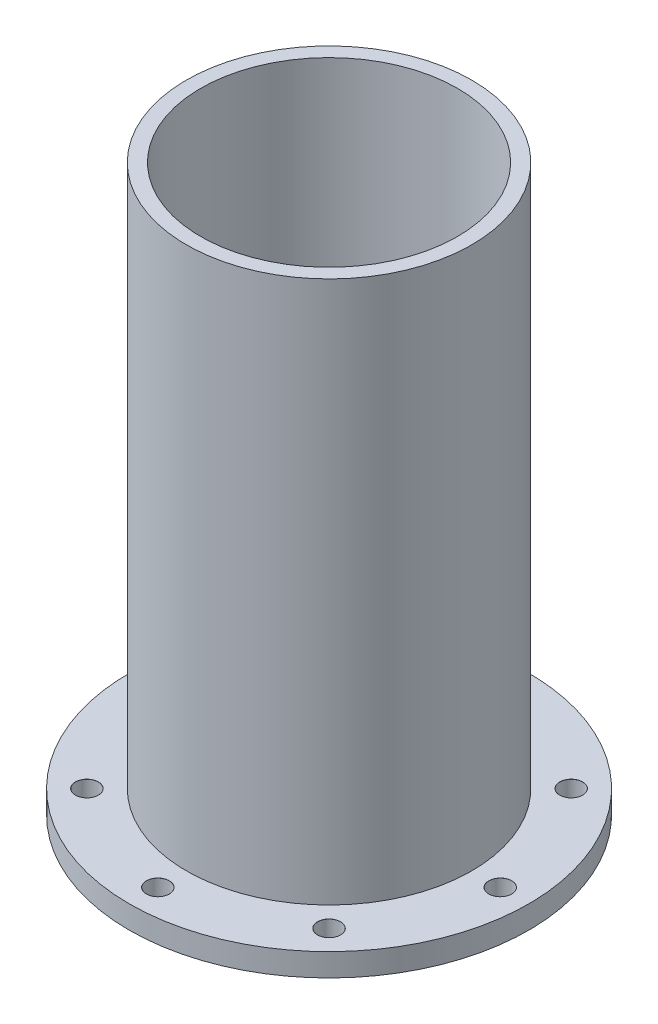
ISO-10303-21;
HEADER;
FILE_DESCRIPTION(('STEP AP214'),'2;1');
FILE_NAME('part.step','',(''),(''),'','','');
FILE_SCHEMA(('AUTOMOTIVE_DESIGN { 1 0 10303 214 1 1 1 1 }'));
ENDSEC;
DATA;
#1=APPLICATION_CONTEXT('core data for automotive mechanical design processes');
#2=APPLICATION_PROTOCOL_DEFINITION('international standard','automotive_design',2000,#1);
#3=PRODUCT_CONTEXT('',#1,'mechanical');
#4=PRODUCT('Part','Part','',(#3));
#5=PRODUCT_RELATED_PRODUCT_CATEGORY('part','',(#4));
#6=PRODUCT_DEFINITION_FORMATION('','',#4);
#7=PRODUCT_DEFINITION_CONTEXT('part definition',#1,'design');
#8=PRODUCT_DEFINITION('design','',#6,#7);
#9=PRODUCT_DEFINITION_SHAPE('','',#8);
#10=(LENGTH_UNIT() NAMED_UNIT(*) SI_UNIT(.MILLI.,.METRE.));
#11=(NAMED_UNIT(*) PLANE_ANGLE_UNIT() SI_UNIT($,.RADIAN.));
#12=(NAMED_UNIT(*) SI_UNIT($,.STERADIAN.) SOLID_ANGLE_UNIT());
#13=UNCERTAINTY_MEASURE_WITH_UNIT(LENGTH_MEASURE(1.E-05),#10,'distance_accuracy_value','');
#14=(GEOMETRIC_REPRESENTATION_CONTEXT(3) GLOBAL_UNCERTAINTY_ASSIGNED_CONTEXT((#13)) GLOBAL_UNIT_ASSIGNED_CONTEXT((#10,
#11,#12)) REPRESENTATION_CONTEXT('',''));
#15=CARTESIAN_POINT('',(0.,0.,0.));
#16=DIRECTION('',(0.,0.,1.));
#17=DIRECTION('',(1.,0.,0.));
#18=AXIS2_PLACEMENT_3D('',#15,#16,#17);
#19=CARTESIAN_POINT('',(0.,0.,0.));
#20=DIRECTION('',(0.,-1.,0.));
#21=DIRECTION('',(0.,0.,-1.));
#22=AXIS2_PLACEMENT_3D('',#19,#20,#21);
#23=PLANE('',#22);
#24=CARTESIAN_POINT('',(0.,0.,0.));
#25=DIRECTION('',(0.,-1.,0.));
#26=DIRECTION('',(0.,0.,-1.));
#27=AXIS2_PLACEMENT_3D('',#24,#25,#26);
#28=CIRCLE('',#27,45.);
#29=CARTESIAN_POINT('',(0.,0.,-45.));
#30=VERTEX_POINT('',#29);
#31=EDGE_CURVE('E132',#30,#30,#28,.T.);
#32=ORIENTED_EDGE('',*,*,#31,.F.);
#33=EDGE_LOOP('',(#32));
#34=FACE_BOUND('',#33,.T.);
#35=CARTESIAN_POINT('',(-42.4264068711934,0.,42.4264068711923));
#36=DIRECTION('',(0.,1.,0.));
#37=DIRECTION('',(0.,0.,1.));
#38=AXIS2_PLACEMENT_3D('',#35,#36,#37);
#39=CIRCLE('',#38,4.);
#40=CARTESIAN_POINT('',(-42.4264068711934,0.,46.4264068711923));
#41=VERTEX_POINT('',#40);
#42=EDGE_CURVE('E116',#41,#41,#39,.T.);
#43=ORIENTED_EDGE('',*,*,#42,.T.);
#44=EDGE_LOOP('',(#43));
#45=FACE_BOUND('',#44,.T.);
#46=CARTESIAN_POINT('',(-6.28466640991764E-13,0.,60.));
#47=DIRECTION('',(0.,1.,0.));
#48=DIRECTION('',(0.,0.,1.));
#49=AXIS2_PLACEMENT_3D('',#46,#47,#48);
#50=CIRCLE('',#49,4.);
#51=CARTESIAN_POINT('',(-6.28466640991764E-13,0.,64.));
#52=VERTEX_POINT('',#51);
#53=EDGE_CURVE('E107',#52,#52,#50,.T.);
#54=ORIENTED_EDGE('',*,*,#53,.T.);
#55=EDGE_LOOP('',(#54));
#56=FACE_BOUND('',#55,.T.);
#57=CARTESIAN_POINT('',(42.4264068711925,0.,42.4264068711932));
#58=DIRECTION('',(0.,1.,0.));
#59=DIRECTION('',(0.,0.,1.));
#60=AXIS2_PLACEMENT_3D('',#57,#58,#59);
#61=CIRCLE('',#60,4.);
#62=CARTESIAN_POINT('',(42.4264068711925,0.,46.4264068711932));
#63=VERTEX_POINT('',#62);
#64=EDGE_CURVE('E98',#63,#63,#61,.T.);
#65=ORIENTED_EDGE('',*,*,#64,.T.);
#66=EDGE_LOOP('',(#65));
#67=FACE_BOUND('',#66,.T.);
#68=CARTESIAN_POINT('',(60.,0.,0.));
#69=DIRECTION('',(0.,1.,0.));
#70=DIRECTION('',(0.,0.,1.));
#71=AXIS2_PLACEMENT_3D('',#68,#69,#70);
#72=CIRCLE('',#71,4.);
#73=CARTESIAN_POINT('',(60.,0.,4.));
#74=VERTEX_POINT('',#73);
#75=EDGE_CURVE('E89',#74,#74,#72,.T.);
#76=ORIENTED_EDGE('',*,*,#75,.T.);
#77=EDGE_LOOP('',(#76));
#78=FACE_BOUND('',#77,.T.);
#79=CARTESIAN_POINT('',(0.,0.,0.));
#80=DIRECTION('',(0.,1.,0.));
#81=DIRECTION('',(0.,0.,1.));
#82=AXIS2_PLACEMENT_3D('',#79,#80,#81);
#83=CIRCLE('',#82,70.);
#84=CARTESIAN_POINT('',(0.,0.,70.));
#85=VERTEX_POINT('',#84);
#86=EDGE_CURVE('E46',#85,#85,#83,.T.);
#87=ORIENTED_EDGE('',*,*,#86,.F.);
#88=EDGE_LOOP('',(#87));
#89=FACE_BOUND('',#88,.T.);
#90=CARTESIAN_POINT('',(-60.,0.,0.));
#91=DIRECTION('',(0.,1.,0.));
#92=DIRECTION('',(0.,0.,1.));
#93=AXIS2_PLACEMENT_3D('',#90,#91,#92);
#94=CIRCLE('',#93,4.);
#95=CARTESIAN_POINT('',(-60.,0.,4.));
#96=VERTEX_POINT('',#95);
#97=EDGE_CURVE('E50',#96,#96,#94,.T.);
#98=ORIENTED_EDGE('',*,*,#97,.T.);
#99=EDGE_LOOP('',(#98));
#100=FACE_BOUND('',#99,.T.);
#101=CARTESIAN_POINT('',(-42.4264068711928,0.,-42.4264068711929));
#102=DIRECTION('',(0.,1.,0.));
#103=DIRECTION('',(0.,0.,1.));
#104=AXIS2_PLACEMENT_3D('',#101,#102,#103);
#105=CIRCLE('',#104,4.);
#106=CARTESIAN_POINT('',(-42.4264068711928,0.,-38.4264068711929));
#107=VERTEX_POINT('',#106);
#108=EDGE_CURVE('E62',#107,#107,#105,.T.);
#109=ORIENTED_EDGE('',*,*,#108,.T.);
#110=EDGE_LOOP('',(#109));
#111=FACE_BOUND('',#110,.T.);
#112=CARTESIAN_POINT('',(2.09488880330588E-13,0.,-60.));
#113=DIRECTION('',(0.,1.,0.));
#114=DIRECTION('',(0.,0.,1.));
#115=AXIS2_PLACEMENT_3D('',#112,#113,#114);
#116=CIRCLE('',#115,4.);
#117=CARTESIAN_POINT('',(2.09488880330588E-13,0.,-56.));
#118=VERTEX_POINT('',#117);
#119=EDGE_CURVE('E71',#118,#118,#116,.T.);
#120=ORIENTED_EDGE('',*,*,#119,.T.);
#121=EDGE_LOOP('',(#120));
#122=FACE_BOUND('',#121,.T.);
#123=CARTESIAN_POINT('',(42.4264068711931,0.,-42.4264068711926));
#124=DIRECTION('',(0.,1.,0.));
#125=DIRECTION('',(0.,0.,1.));
#126=AXIS2_PLACEMENT_3D('',#123,#124,#125);
#127=CIRCLE('',#126,4.);
#128=CARTESIAN_POINT('',(42.4264068711931,0.,-38.4264068711926));
#129=VERTEX_POINT('',#128);
#130=EDGE_CURVE('E80',#129,#129,#127,.T.);
#131=ORIENTED_EDGE('',*,*,#130,.T.);
#132=EDGE_LOOP('',(#131));
#133=FACE_BOUND('',#132,.T.);
#134=ADVANCED_FACE('F39',(#34,#45,#56,#67,#78,#89,#100,#111,#122,#133),#23,.T.);
#135=CARTESIAN_POINT('',(0.,8.,0.));
#136=DIRECTION('',(0.,1.,0.));
#137=DIRECTION('',(0.,0.,1.));
#138=AXIS2_PLACEMENT_3D('',#135,#136,#137);
#139=PLANE('',#138);
#140=CARTESIAN_POINT('',(0.,7.99999999999999,0.));
#141=DIRECTION('',(0.,-1.,0.));
#142=DIRECTION('',(0.,0.,-1.));
#143=AXIS2_PLACEMENT_3D('',#140,#141,#142);
#144=CIRCLE('',#143,50.);
#145=CARTESIAN_POINT('',(0.,7.99999999999999,-50.));
#146=VERTEX_POINT('',#145);
#147=EDGE_CURVE('E128',#146,#146,#144,.T.);
#148=ORIENTED_EDGE('',*,*,#147,.T.);
#149=EDGE_LOOP('',(#148));
#150=FACE_BOUND('',#149,.T.);
#151=CARTESIAN_POINT('',(-42.4264068711934,8.,42.4264068711923));
#152=DIRECTION('',(0.,1.,0.));
#153=DIRECTION('',(0.,0.,1.));
#154=AXIS2_PLACEMENT_3D('',#151,#152,#153);
#155=CIRCLE('',#154,4.025);
#156=CARTESIAN_POINT('',(-42.4264068711934,8.,46.4514068711923));
#157=VERTEX_POINT('',#156);
#158=EDGE_CURVE('E122',#157,#157,#155,.T.);
#159=ORIENTED_EDGE('',*,*,#158,.F.);
#160=EDGE_LOOP('',(#159));
#161=FACE_BOUND('',#160,.T.);
#162=CARTESIAN_POINT('',(-6.28466640991764E-13,8.,60.));
#163=DIRECTION('',(0.,1.,0.));
#164=DIRECTION('',(0.,0.,1.));
#165=AXIS2_PLACEMENT_3D('',#162,#163,#164);
#166=CIRCLE('',#165,4.025);
#167=CARTESIAN_POINT('',(-6.28466640991764E-13,8.,64.025));
#168=VERTEX_POINT('',#167);
#169=EDGE_CURVE('E113',#168,#168,#166,.T.);
#170=ORIENTED_EDGE('',*,*,#169,.F.);
#171=EDGE_LOOP('',(#170));
#172=FACE_BOUND('',#171,.T.);
#173=CARTESIAN_POINT('',(42.4264068711925,8.,42.4264068711932));
#174=DIRECTION('',(0.,1.,0.));
#175=DIRECTION('',(0.,0.,1.));
#176=AXIS2_PLACEMENT_3D('',#173,#174,#175);
#177=CIRCLE('',#176,4.025);
#178=CARTESIAN_POINT('',(42.4264068711925,8.,46.4514068711932));
#179=VERTEX_POINT('',#178);
#180=EDGE_CURVE('E104',#179,#179,#177,.T.);
#181=ORIENTED_EDGE('',*,*,#180,.F.);
#182=EDGE_LOOP('',(#181));
#183=FACE_BOUND('',#182,.T.);
#184=CARTESIAN_POINT('',(60.,8.,0.));
#185=DIRECTION('',(0.,1.,0.));
#186=DIRECTION('',(0.,0.,1.));
#187=AXIS2_PLACEMENT_3D('',#184,#185,#186);
#188=CIRCLE('',#187,4.025);
#189=CARTESIAN_POINT('',(60.,8.,4.025));
#190=VERTEX_POINT('',#189);
#191=EDGE_CURVE('E95',#190,#190,#188,.T.);
#192=ORIENTED_EDGE('',*,*,#191,.F.);
#193=EDGE_LOOP('',(#192));
#194=FACE_BOUND('',#193,.T.);
#195=CARTESIAN_POINT('',(42.4264068711931,8.,-42.4264068711926));
#196=DIRECTION('',(0.,1.,0.));
#197=DIRECTION('',(0.,0.,1.));
#198=AXIS2_PLACEMENT_3D('',#195,#196,#197);
#199=CIRCLE('',#198,4.025);
#200=CARTESIAN_POINT('',(42.4264068711931,8.,-38.4014068711926));
#201=VERTEX_POINT('',#200);
#202=EDGE_CURVE('E86',#201,#201,#199,.T.);
#203=ORIENTED_EDGE('',*,*,#202,.F.);
#204=EDGE_LOOP('',(#203));
#205=FACE_BOUND('',#204,.T.);
#206=CARTESIAN_POINT('',(2.09488880330588E-13,8.,-60.));
#207=DIRECTION('',(0.,1.,0.));
#208=DIRECTION('',(0.,0.,1.));
#209=AXIS2_PLACEMENT_3D('',#206,#207,#208);
#210=CIRCLE('',#209,4.025);
#211=CARTESIAN_POINT('',(2.09488880330588E-13,8.,-55.975));
#212=VERTEX_POINT('',#211);
#213=EDGE_CURVE('E77',#212,#212,#210,.T.);
#214=ORIENTED_EDGE('',*,*,#213,.F.);
#215=EDGE_LOOP('',(#214));
#216=FACE_BOUND('',#215,.T.);
#217=CARTESIAN_POINT('',(-42.4264068711928,8.,-42.4264068711929));
#218=DIRECTION('',(0.,1.,0.));
#219=DIRECTION('',(0.,0.,1.));
#220=AXIS2_PLACEMENT_3D('',#217,#218,#219);
#221=CIRCLE('',#220,4.025);
#222=CARTESIAN_POINT('',(-42.4264068711928,8.,-38.4014068711929));
#223=VERTEX_POINT('',#222);
#224=EDGE_CURVE('E68',#223,#223,#221,.T.);
#225=ORIENTED_EDGE('',*,*,#224,.F.);
#226=EDGE_LOOP('',(#225));
#227=FACE_BOUND('',#226,.T.);
#228=CARTESIAN_POINT('',(-60.,8.,0.));
#229=DIRECTION('',(0.,1.,0.));
#230=DIRECTION('',(0.,0.,1.));
#231=AXIS2_PLACEMENT_3D('',#228,#229,#230);
#232=CIRCLE('',#231,4.025);
#233=CARTESIAN_POINT('',(-60.,8.,4.025));
#234=VERTEX_POINT('',#233);
#235=EDGE_CURVE('E59',#234,#234,#232,.T.);
#236=ORIENTED_EDGE('',*,*,#235,.F.);
#237=EDGE_LOOP('',(#236));
#238=FACE_BOUND('',#237,.T.);
#239=CARTESIAN_POINT('',(0.,7.99999999999999,0.));
#240=DIRECTION('',(0.,1.,0.));
#241=DIRECTION('',(0.,0.,1.));
#242=AXIS2_PLACEMENT_3D('',#239,#240,#241);
#243=CIRCLE('',#242,70.);
#244=CARTESIAN_POINT('',(0.,7.99999999999999,70.));
#245=VERTEX_POINT('',#244);
#246=EDGE_CURVE('E10',#245,#245,#243,.T.);
#247=ORIENTED_EDGE('',*,*,#246,.T.);
#248=EDGE_LOOP('',(#247));
#249=FACE_BOUND('',#248,.T.);
#250=ADVANCED_FACE('F41',(#150,#161,#172,#183,#194,#205,#216,#227,#238,#249),#139,.T.);
#251=CARTESIAN_POINT('',(0.,76.6194972326676,0.));
#252=DIRECTION('',(0.,1.,0.));
#253=DIRECTION('',(0.,0.,1.));
#254=AXIS2_PLACEMENT_3D('',#251,#252,#253);
#255=CYLINDRICAL_SURFACE('',#254,70.);
#256=ORIENTED_EDGE('',*,*,#86,.T.);
#257=EDGE_LOOP('',(#256));
#258=FACE_BOUND('',#257,.T.);
#259=ORIENTED_EDGE('',*,*,#246,.F.);
#260=EDGE_LOOP('',(#259));
#261=FACE_BOUND('',#260,.T.);
#262=ADVANCED_FACE('F184',(#258,#261),#255,.T.);
#263=CARTESIAN_POINT('',(-60.,8.,0.));
#264=DIRECTION('',(0.,1.,0.));
#265=DIRECTION('',(0.,0.,1.));
#266=AXIS2_PLACEMENT_3D('',#263,#264,#265);
#267=CYLINDRICAL_SURFACE('',#266,4.);
#268=ORIENTED_EDGE('',*,*,#97,.F.);
#269=EDGE_LOOP('',(#268));
#270=FACE_BOUND('',#269,.T.);
#271=CARTESIAN_POINT('',(-60.,7.97902250922056,0.));
#272=DIRECTION('',(0.,1.,0.));
#273=DIRECTION('',(0.,0.,1.));
#274=AXIS2_PLACEMENT_3D('',#271,#272,#273);
#275=CIRCLE('',#274,4.);
#276=CARTESIAN_POINT('',(-60.,7.97902250922056,4.));
#277=VERTEX_POINT('',#276);
#278=EDGE_CURVE('E54',#277,#277,#275,.T.);
#279=ORIENTED_EDGE('',*,*,#278,.T.);
#280=EDGE_LOOP('',(#279));
#281=FACE_BOUND('',#280,.T.);
#282=ADVANCED_FACE('F195',(#270,#281),#267,.F.);
#283=CARTESIAN_POINT('',(-60.,8.,0.));
#284=DIRECTION('',(0.,1.,0.));
#285=DIRECTION('',(0.,0.,1.));
#286=AXIS2_PLACEMENT_3D('',#283,#284,#285);
#287=CONICAL_SURFACE('',#286,4.025,0.87266462599705);
#288=ORIENTED_EDGE('',*,*,#278,.F.);
#289=EDGE_LOOP('',(#288));
#290=FACE_BOUND('',#289,.T.);
#291=ORIENTED_EDGE('',*,*,#235,.T.);
#292=EDGE_LOOP('',(#291));
#293=FACE_BOUND('',#292,.T.);
#294=ADVANCED_FACE('F192',(#290,#293),#287,.F.);
#295=CARTESIAN_POINT('',(-42.4264068711928,8.,-42.4264068711929));
#296=DIRECTION('',(0.,1.,0.));
#297=DIRECTION('',(0.,0.,1.));
#298=AXIS2_PLACEMENT_3D('',#295,#296,#297);
#299=CYLINDRICAL_SURFACE('',#298,4.);
#300=ORIENTED_EDGE('',*,*,#108,.F.);
#301=EDGE_LOOP('',(#300));
#302=FACE_BOUND('',#301,.T.);
#303=CARTESIAN_POINT('',(-42.4264068711928,7.97902250922056,-42.4264068711929));
#304=DIRECTION('',(0.,1.,0.));
#305=DIRECTION('',(0.,0.,1.));
#306=AXIS2_PLACEMENT_3D('',#303,#304,#305);
#307=CIRCLE('',#306,4.);
#308=CARTESIAN_POINT('',(-42.4264068711928,7.97902250922056,-38.4264068711929));
#309=VERTEX_POINT('',#308);
#310=EDGE_CURVE('E65',#309,#309,#307,.T.);
#311=ORIENTED_EDGE('',*,*,#310,.T.);
#312=EDGE_LOOP('',(#311));
#313=FACE_BOUND('',#312,.T.);
#314=ADVANCED_FACE('F194',(#302,#313),#299,.F.);
#315=CARTESIAN_POINT('',(-42.4264068711928,8.,-42.4264068711929));
#316=DIRECTION('',(0.,1.,0.));
#317=DIRECTION('',(0.,0.,1.));
#318=AXIS2_PLACEMENT_3D('',#315,#316,#317);
#319=CONICAL_SURFACE('',#318,4.025,0.872664625997186);
#320=ORIENTED_EDGE('',*,*,#310,.F.);
#321=EDGE_LOOP('',(#320));
#322=FACE_BOUND('',#321,.T.);
#323=ORIENTED_EDGE('',*,*,#224,.T.);
#324=EDGE_LOOP('',(#323));
#325=FACE_BOUND('',#324,.T.);
#326=ADVANCED_FACE('F202',(#322,#325),#319,.F.);
#327=CARTESIAN_POINT('',(2.09488880330588E-13,8.,-60.));
#328=DIRECTION('',(0.,1.,0.));
#329=DIRECTION('',(0.,0.,1.));
#330=AXIS2_PLACEMENT_3D('',#327,#328,#329);
#331=CYLINDRICAL_SURFACE('',#330,4.);
#332=ORIENTED_EDGE('',*,*,#119,.F.);
#333=EDGE_LOOP('',(#332));
#334=FACE_BOUND('',#333,.T.);
#335=CARTESIAN_POINT('',(2.09488880330588E-13,7.97902250922056,-60.));
#336=DIRECTION('',(0.,1.,0.));
#337=DIRECTION('',(0.,0.,1.));
#338=AXIS2_PLACEMENT_3D('',#335,#336,#337);
#339=CIRCLE('',#338,4.);
#340=CARTESIAN_POINT('',(2.09488880330588E-13,7.97902250922056,-56.));
#341=VERTEX_POINT('',#340);
#342=EDGE_CURVE('E74',#341,#341,#339,.T.);
#343=ORIENTED_EDGE('',*,*,#342,.T.);
#344=EDGE_LOOP('',(#343));
#345=FACE_BOUND('',#344,.T.);
#346=ADVANCED_FACE('F231',(#334,#345),#331,.F.);
#347=CARTESIAN_POINT('',(2.09488880330588E-13,8.,-60.));
#348=DIRECTION('',(0.,1.,0.));
#349=DIRECTION('',(0.,0.,1.));
#350=AXIS2_PLACEMENT_3D('',#347,#348,#349);
#351=CONICAL_SURFACE('',#350,4.025,0.872664625997118);
#352=ORIENTED_EDGE('',*,*,#342,.F.);
#353=EDGE_LOOP('',(#352));
#354=FACE_BOUND('',#353,.T.);
#355=ORIENTED_EDGE('',*,*,#213,.T.);
#356=EDGE_LOOP('',(#355));
#357=FACE_BOUND('',#356,.T.);
#358=ADVANCED_FACE('F172',(#354,#357),#351,.F.);
#359=CARTESIAN_POINT('',(42.4264068711931,8.,-42.4264068711926));
#360=DIRECTION('',(0.,1.,0.));
#361=DIRECTION('',(0.,0.,1.));
#362=AXIS2_PLACEMENT_3D('',#359,#360,#361);
#363=CYLINDRICAL_SURFACE('',#362,4.);
#364=ORIENTED_EDGE('',*,*,#130,.F.);
#365=EDGE_LOOP('',(#364));
#366=FACE_BOUND('',#365,.T.);
#367=CARTESIAN_POINT('',(42.4264068711931,7.97902250922056,-42.4264068711926));
#368=DIRECTION('',(0.,1.,0.));
#369=DIRECTION('',(0.,0.,1.));
#370=AXIS2_PLACEMENT_3D('',#367,#368,#369);
#371=CIRCLE('',#370,4.);
#372=CARTESIAN_POINT('',(42.4264068711931,7.97902250922056,-38.4264068711926));
#373=VERTEX_POINT('',#372);
#374=EDGE_CURVE('E83',#373,#373,#371,.T.);
#375=ORIENTED_EDGE('',*,*,#374,.T.);
#376=EDGE_LOOP('',(#375));
#377=FACE_BOUND('',#376,.T.);
#378=ADVANCED_FACE('F168',(#366,#377),#363,.F.);
#379=CARTESIAN_POINT('',(42.4264068711931,8.,-42.4264068711926));
#380=DIRECTION('',(0.,1.,0.));
#381=DIRECTION('',(0.,0.,1.));
#382=AXIS2_PLACEMENT_3D('',#379,#380,#381);
#383=CONICAL_SURFACE('',#382,4.025,0.87266462599705);
#384=ORIENTED_EDGE('',*,*,#374,.F.);
#385=EDGE_LOOP('',(#384));
#386=FACE_BOUND('',#385,.T.);
#387=ORIENTED_EDGE('',*,*,#202,.T.);
#388=EDGE_LOOP('',(#387));
#389=FACE_BOUND('',#388,.T.);
#390=ADVANCED_FACE('F171',(#386,#389),#383,.F.);
#391=CARTESIAN_POINT('',(60.,8.,0.));
#392=DIRECTION('',(0.,1.,0.));
#393=DIRECTION('',(0.,0.,1.));
#394=AXIS2_PLACEMENT_3D('',#391,#392,#393);
#395=CYLINDRICAL_SURFACE('',#394,4.);
#396=ORIENTED_EDGE('',*,*,#75,.F.);
#397=EDGE_LOOP('',(#396));
#398=FACE_BOUND('',#397,.T.);
#399=CARTESIAN_POINT('',(60.,7.97902250922056,0.));
#400=DIRECTION('',(0.,1.,0.));
#401=DIRECTION('',(0.,0.,1.));
#402=AXIS2_PLACEMENT_3D('',#399,#400,#401);
#403=CIRCLE('',#402,4.);
#404=CARTESIAN_POINT('',(60.,7.97902250922056,4.));
#405=VERTEX_POINT('',#404);
#406=EDGE_CURVE('E92',#405,#405,#403,.T.);
#407=ORIENTED_EDGE('',*,*,#406,.T.);
#408=EDGE_LOOP('',(#407));
#409=FACE_BOUND('',#408,.T.);
#410=ADVANCED_FACE('F178',(#398,#409),#395,.F.);
#411=CARTESIAN_POINT('',(60.,8.,0.));
#412=DIRECTION('',(0.,1.,0.));
#413=DIRECTION('',(0.,0.,1.));
#414=AXIS2_PLACEMENT_3D('',#411,#412,#413);
#415=CONICAL_SURFACE('',#414,4.025,0.87266462599705);
#416=ORIENTED_EDGE('',*,*,#406,.F.);
#417=EDGE_LOOP('',(#416));
#418=FACE_BOUND('',#417,.T.);
#419=ORIENTED_EDGE('',*,*,#191,.T.);
#420=EDGE_LOOP('',(#419));
#421=FACE_BOUND('',#420,.T.);
#422=ADVANCED_FACE('F257',(#418,#421),#415,.F.);
#423=CARTESIAN_POINT('',(42.4264068711925,8.,42.4264068711932));
#424=DIRECTION('',(0.,1.,0.));
#425=DIRECTION('',(0.,0.,1.));
#426=AXIS2_PLACEMENT_3D('',#423,#424,#425);
#427=CYLINDRICAL_SURFACE('',#426,4.);
#428=ORIENTED_EDGE('',*,*,#64,.F.);
#429=EDGE_LOOP('',(#428));
#430=FACE_BOUND('',#429,.T.);
#431=CARTESIAN_POINT('',(42.4264068711925,7.97902250922056,42.4264068711932));
#432=DIRECTION('',(0.,1.,0.));
#433=DIRECTION('',(0.,0.,1.));
#434=AXIS2_PLACEMENT_3D('',#431,#432,#433);
#435=CIRCLE('',#434,4.);
#436=CARTESIAN_POINT('',(42.4264068711925,7.97902250922056,46.4264068711932));
#437=VERTEX_POINT('',#436);
#438=EDGE_CURVE('E101',#437,#437,#435,.T.);
#439=ORIENTED_EDGE('',*,*,#438,.T.);
#440=EDGE_LOOP('',(#439));
#441=FACE_BOUND('',#440,.T.);
#442=ADVANCED_FACE('F262',(#430,#441),#427,.F.);
#443=CARTESIAN_POINT('',(42.4264068711925,8.,42.4264068711932));
#444=DIRECTION('',(0.,1.,0.));
#445=DIRECTION('',(0.,0.,1.));
#446=AXIS2_PLACEMENT_3D('',#443,#444,#445);
#447=CONICAL_SURFACE('',#446,4.025,0.87266462599705);
#448=ORIENTED_EDGE('',*,*,#438,.F.);
#449=EDGE_LOOP('',(#448));
#450=FACE_BOUND('',#449,.T.);
#451=ORIENTED_EDGE('',*,*,#180,.T.);
#452=EDGE_LOOP('',(#451));
#453=FACE_BOUND('',#452,.T.);
#454=ADVANCED_FACE('F270',(#450,#453),#447,.F.);
#455=CARTESIAN_POINT('',(-6.28466640991764E-13,8.,60.));
#456=DIRECTION('',(0.,1.,0.));
#457=DIRECTION('',(0.,0.,1.));
#458=AXIS2_PLACEMENT_3D('',#455,#456,#457);
#459=CYLINDRICAL_SURFACE('',#458,4.);
#460=ORIENTED_EDGE('',*,*,#53,.F.);
#461=EDGE_LOOP('',(#460));
#462=FACE_BOUND('',#461,.T.);
#463=CARTESIAN_POINT('',(-6.28466640991764E-13,7.97902250922056,60.));
#464=DIRECTION('',(0.,1.,0.));
#465=DIRECTION('',(0.,0.,1.));
#466=AXIS2_PLACEMENT_3D('',#463,#464,#465);
#467=CIRCLE('',#466,4.);
#468=CARTESIAN_POINT('',(-6.28466640991764E-13,7.97902250922056,64.));
#469=VERTEX_POINT('',#468);
#470=EDGE_CURVE('E110',#469,#469,#467,.T.);
#471=ORIENTED_EDGE('',*,*,#470,.T.);
#472=EDGE_LOOP('',(#471));
#473=FACE_BOUND('',#472,.T.);
#474=ADVANCED_FACE('F275',(#462,#473),#459,.F.);
#475=CARTESIAN_POINT('',(-6.28466640991764E-13,8.,60.));
#476=DIRECTION('',(0.,1.,0.));
#477=DIRECTION('',(0.,0.,1.));
#478=AXIS2_PLACEMENT_3D('',#475,#476,#477);
#479=CONICAL_SURFACE('',#478,4.025,0.872664625997118);
#480=ORIENTED_EDGE('',*,*,#470,.F.);
#481=EDGE_LOOP('',(#480));
#482=FACE_BOUND('',#481,.T.);
#483=ORIENTED_EDGE('',*,*,#169,.T.);
#484=EDGE_LOOP('',(#483));
#485=FACE_BOUND('',#484,.T.);
#486=ADVANCED_FACE('F283',(#482,#485),#479,.F.);
#487=CARTESIAN_POINT('',(-42.4264068711934,8.,42.4264068711923));
#488=DIRECTION('',(0.,1.,0.));
#489=DIRECTION('',(0.,0.,1.));
#490=AXIS2_PLACEMENT_3D('',#487,#488,#489);
#491=CYLINDRICAL_SURFACE('',#490,4.);
#492=ORIENTED_EDGE('',*,*,#42,.F.);
#493=EDGE_LOOP('',(#492));
#494=FACE_BOUND('',#493,.T.);
#495=CARTESIAN_POINT('',(-42.4264068711934,7.97902250922056,42.4264068711923));
#496=DIRECTION('',(0.,1.,0.));
#497=DIRECTION('',(0.,0.,1.));
#498=AXIS2_PLACEMENT_3D('',#495,#496,#497);
#499=CIRCLE('',#498,4.);
#500=CARTESIAN_POINT('',(-42.4264068711934,7.97902250922056,46.4264068711923));
#501=VERTEX_POINT('',#500);
#502=EDGE_CURVE('E119',#501,#501,#499,.T.);
#503=ORIENTED_EDGE('',*,*,#502,.T.);
#504=EDGE_LOOP('',(#503));
#505=FACE_BOUND('',#504,.T.);
#506=ADVANCED_FACE('F288',(#494,#505),#491,.F.);
#507=CARTESIAN_POINT('',(-42.4264068711934,8.,42.4264068711923));
#508=DIRECTION('',(0.,1.,0.));
#509=DIRECTION('',(0.,0.,1.));
#510=AXIS2_PLACEMENT_3D('',#507,#508,#509);
#511=CONICAL_SURFACE('',#510,4.025,0.87266462599705);
#512=ORIENTED_EDGE('',*,*,#502,.F.);
#513=EDGE_LOOP('',(#512));
#514=FACE_BOUND('',#513,.T.);
#515=ORIENTED_EDGE('',*,*,#158,.T.);
#516=EDGE_LOOP('',(#515));
#517=FACE_BOUND('',#516,.T.);
#518=ADVANCED_FACE('F296',(#514,#517),#511,.F.);
#519=CARTESIAN_POINT('',(0.,198.,0.));
#520=DIRECTION('',(0.,-1.,0.));
#521=DIRECTION('',(0.,0.,-1.));
#522=AXIS2_PLACEMENT_3D('',#519,#520,#521);
#523=PLANE('',#522);
#524=CARTESIAN_POINT('',(0.,198.,0.));
#525=DIRECTION('',(0.,-1.,0.));
#526=DIRECTION('',(0.,0.,-1.));
#527=AXIS2_PLACEMENT_3D('',#524,#525,#526);
#528=CIRCLE('',#527,45.);
#529=CARTESIAN_POINT('',(0.,198.,-45.));
#530=VERTEX_POINT('',#529);
#531=EDGE_CURVE('E131',#530,#530,#528,.T.);
#532=ORIENTED_EDGE('',*,*,#531,.T.);
#533=EDGE_LOOP('',(#532));
#534=FACE_BOUND('',#533,.T.);
#535=CARTESIAN_POINT('',(0.,198.,0.));
#536=DIRECTION('',(0.,-1.,0.));
#537=DIRECTION('',(0.,0.,-1.));
#538=AXIS2_PLACEMENT_3D('',#535,#536,#537);
#539=CIRCLE('',#538,50.);
#540=CARTESIAN_POINT('',(0.,198.,-50.));
#541=VERTEX_POINT('',#540);
#542=EDGE_CURVE('E125',#541,#541,#539,.T.);
#543=ORIENTED_EDGE('',*,*,#542,.F.);
#544=EDGE_LOOP('',(#543));
#545=FACE_BOUND('',#544,.T.);
#546=ADVANCED_FACE('F138',(#534,#545),#523,.F.);
#547=CARTESIAN_POINT('',(0.,8.,0.));
#548=DIRECTION('',(0.,-1.,0.));
#549=DIRECTION('',(0.,0.,-1.));
#550=AXIS2_PLACEMENT_3D('',#547,#548,#549);
#551=CYLINDRICAL_SURFACE('',#550,50.);
#552=ORIENTED_EDGE('',*,*,#147,.F.);
#553=EDGE_LOOP('',(#552));
#554=FACE_BOUND('',#553,.T.);
#555=ORIENTED_EDGE('',*,*,#542,.T.);
#556=EDGE_LOOP('',(#555));
#557=FACE_BOUND('',#556,.T.);
#558=ADVANCED_FACE('F144',(#554,#557),#551,.T.);
#559=CARTESIAN_POINT('',(0.,198.,0.));
#560=DIRECTION('',(0.,-1.,0.));
#561=DIRECTION('',(0.,0.,-1.));
#562=AXIS2_PLACEMENT_3D('',#559,#560,#561);
#563=CYLINDRICAL_SURFACE('',#562,45.);
#564=ORIENTED_EDGE('',*,*,#531,.F.);
#565=EDGE_LOOP('',(#564));
#566=FACE_BOUND('',#565,.T.);
#567=ORIENTED_EDGE('',*,*,#31,.T.);
#568=EDGE_LOOP('',(#567));
#569=FACE_BOUND('',#568,.T.);
#570=ADVANCED_FACE('F141',(#566,#569),#563,.F.);
#571=CLOSED_SHELL('',(#134,#250,#262,#282,#294,#314,#326,#346,#358,#378,#390,#410,#422,#442,
#454,#474,#486,#506,#518,#546,#558,#570));
#572=MANIFOLD_SOLID_BREP('B2',#571);
#573=ADVANCED_BREP_SHAPE_REPRESENTATION('',(#18,#572),#14);
#574=SHAPE_DEFINITION_REPRESENTATION(#9,#573);
ENDSEC;
END-ISO-10303-21;
